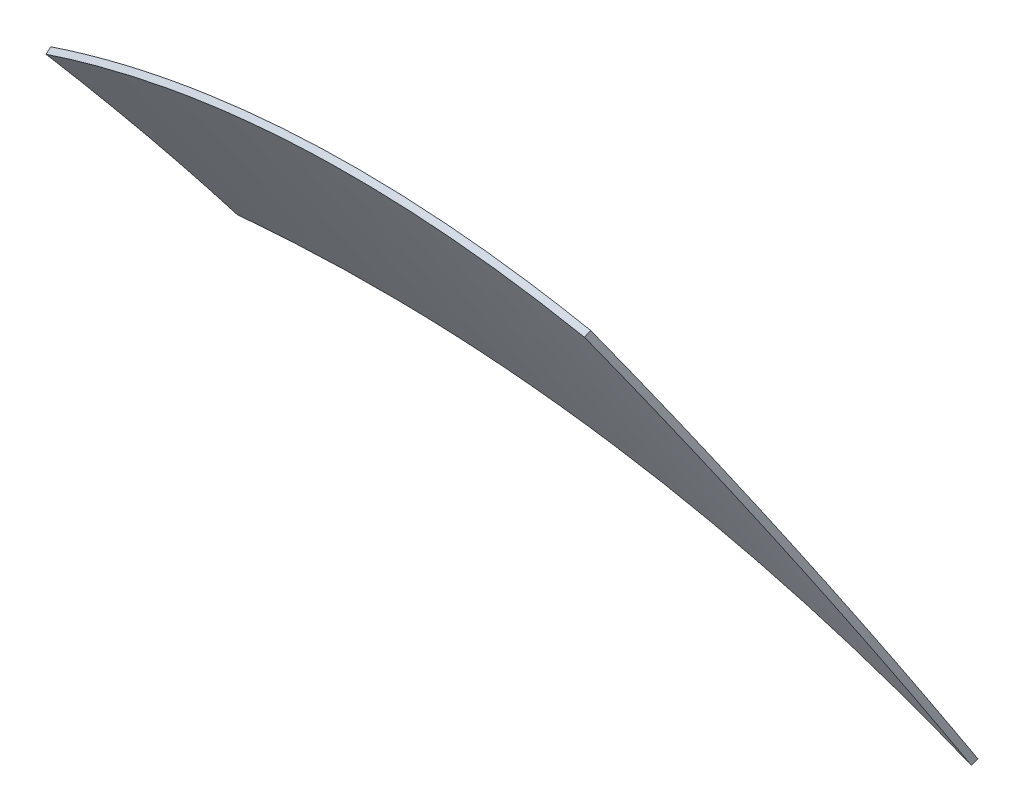
ISO-10303-21;
HEADER;
FILE_DESCRIPTION(('STEP AP214'),'2;1');
FILE_NAME('part.step','',(''),(''),'','','');
FILE_SCHEMA(('AUTOMOTIVE_DESIGN { 1 0 10303 214 1 1 1 1 }'));
ENDSEC;
DATA;
#1=APPLICATION_CONTEXT('core data for automotive mechanical design processes');
#2=APPLICATION_PROTOCOL_DEFINITION('international standard','automotive_design',2000,#1);
#3=PRODUCT_CONTEXT('',#1,'mechanical');
#4=PRODUCT('Part','Part','',(#3));
#5=PRODUCT_RELATED_PRODUCT_CATEGORY('part','',(#4));
#6=PRODUCT_DEFINITION_FORMATION('','',#4);
#7=PRODUCT_DEFINITION_CONTEXT('part definition',#1,'design');
#8=PRODUCT_DEFINITION('design','',#6,#7);
#9=PRODUCT_DEFINITION_SHAPE('','',#8);
#10=(LENGTH_UNIT() NAMED_UNIT(*) SI_UNIT(.MILLI.,.METRE.));
#11=(NAMED_UNIT(*) PLANE_ANGLE_UNIT() SI_UNIT($,.RADIAN.));
#12=(NAMED_UNIT(*) SI_UNIT($,.STERADIAN.) SOLID_ANGLE_UNIT());
#13=UNCERTAINTY_MEASURE_WITH_UNIT(LENGTH_MEASURE(1.E-05),#10,'distance_accuracy_value','');
#14=(GEOMETRIC_REPRESENTATION_CONTEXT(3) GLOBAL_UNCERTAINTY_ASSIGNED_CONTEXT((#13)) GLOBAL_UNIT_ASSIGNED_CONTEXT((#10,
#11,#12)) REPRESENTATION_CONTEXT('',''));
#15=CARTESIAN_POINT('',(0.,0.,0.));
#16=DIRECTION('',(0.,0.,1.));
#17=DIRECTION('',(1.,0.,0.));
#18=AXIS2_PLACEMENT_3D('',#15,#16,#17);
#19=CARTESIAN_POINT('',(143.886111195987,-179.002888895488,-2.70380006520971));
#20=DIRECTION('',(0.,0.,1.));
#21=DIRECTION('',(1.,0.,0.));
#22=AXIS2_PLACEMENT_3D('',#19,#20,#21);
#23=CONICAL_SURFACE('',#22,60.5897364806193,0.959931088596881);
#24=CARTESIAN_POINT('',(159.000603282272,-120.406885992308,-2.75685890943696));
#25=CARTESIAN_POINT('',(158.868996372965,-120.415108019953,-2.78545030843787));
#26=CARTESIAN_POINT('',(158.737427104817,-120.42380557177,-2.81408465073214));
#27=CARTESIAN_POINT('',(158.079736988366,-120.469669164971,-2.95747724797371));
#28=CARTESIAN_POINT('',(157.554232861495,-120.513953816298,-3.07286603493699));
#29=CARTESIAN_POINT('',(156.504984534706,-120.617575436179,-3.30487128910305));
#30=CARTESIAN_POINT('',(155.981240332852,-120.676912388172,-3.42148775495486));
#31=CARTESIAN_POINT('',(155.197293839859,-120.777122266393,-3.59725890114365));
#32=CARTESIAN_POINT('',(154.936266313888,-120.812391448551,-3.65598815937559));
#33=CARTESIAN_POINT('',(154.154016879108,-120.923795180198,-3.83260331287828));
#34=CARTESIAN_POINT('',(153.633666673088,-121.005521545311,-3.95090800184045));
#35=CARTESIAN_POINT('',(152.855288534,-121.139225228157,-4.12913834706854));
#36=CARTESIAN_POINT('',(152.596196517545,-121.185643564327,-4.18867514075154));
#37=CARTESIAN_POINT('',(151.819987968957,-121.330460371902,-4.36768401673878));
#38=CARTESIAN_POINT('',(151.303977427224,-121.434414597671,-4.48754584467776));
#39=CARTESIAN_POINT('',(150.532586401106,-121.601400992677,-4.66807100862768));
#40=CARTESIAN_POINT('',(150.275902940667,-121.65890330945,-4.72836589665372));
#41=CARTESIAN_POINT('',(149.507171471385,-121.836958599759,-4.90963885732585));
#42=CARTESIAN_POINT('',(148.996480970647,-121.963052141057,-5.03099626477721));
#43=CARTESIAN_POINT('',(147.97916095419,-122.229848783316,-5.27461689856439));
#44=CARTESIAN_POINT('',(147.472531433807,-122.37055186749,-5.39688012385928));
#45=CARTESIAN_POINT('',(146.463681735959,-122.666356472557,-5.64218370444104));
#46=CARTESIAN_POINT('',(145.961461553628,-122.821457977551,-5.76522405886974));
#47=CARTESIAN_POINT('',(144.96180367828,-123.145881553891,-6.01197671203673));
#48=CARTESIAN_POINT('',(144.464365981883,-123.315203615185,-6.13568901029999));
#49=CARTESIAN_POINT('',(143.474645062377,-123.66790318532,-6.38369270026669));
#50=CARTESIAN_POINT('',(142.9823618376,-123.851280689618,-6.50798409178284));
#51=CARTESIAN_POINT('',(142.003329601619,-124.231943844562,-6.75706926980549));
#52=CARTESIAN_POINT('',(141.516580590689,-124.4292294959,-6.88186305633694));
#53=CARTESIAN_POINT('',(140.549010723808,-124.837570668622,-7.1318871292262));
#54=CARTESIAN_POINT('',(140.06818987032,-125.048626195729,-7.2571174157654));
#55=CARTESIAN_POINT('',(138.811781328013,-125.621737577864,-7.58703760858172));
#56=CARTESIAN_POINT('',(138.041430416745,-125.99511797922,-7.79205746736365));
#57=CARTESIAN_POINT('',(137.280317100655,-126.38641701106,-7.99752302693644));
#58=B_SPLINE_CURVE_WITH_KNOTS('',3,(#24,#25,#26,#27,#28,#29,#30,#31,#32,#33,#34,#35,#36,#37,#38,
#39,#40,#41,#42,#43,#44,#45,#46,#47,#48,#49,#50,#51,#52,#53,#54,#55,#56,#57),.UNSPECIFIED.,.F.,
.F.,(4,2,2,2,2,2,2,2,2,2,2,2,2,2,2,2,4),(0.,0.404785696413259,2.02408023166759,3.64337298521062,
4.4529591876801,6.0722507887824,6.88183696519446,8.5011290756143,9.31071542367979,
10.9300092124914,12.5493011407591,14.1685912811835,15.78788027701,17.4071687491842,
19.0264573017742,20.6457465272929,23.2857191188557),.UNSPECIFIED.);
#59=CARTESIAN_POINT('',(159.000603282272,-120.406885992308,-2.75685890943713));
#60=VERTEX_POINT('',#59);
#61=CARTESIAN_POINT('',(137.280317100655,-126.38641701106,-7.99752302693646));
#62=VERTEX_POINT('',#61);
#63=EDGE_CURVE('E24',#60,#62,#58,.T.);
#64=ORIENTED_EDGE('',*,*,#63,.T.);
#65=CARTESIAN_POINT('',(137.280317100655,-126.38641701106,-7.99752302693634));
#66=CARTESIAN_POINT('',(137.346073829919,-126.480169329832,-8.06839270908214));
#67=CARTESIAN_POINT('',(137.410642669431,-126.57455949528,-8.13954595752961));
#68=CARTESIAN_POINT('',(137.727738792608,-127.049819377052,-8.49686090490361));
#69=CARTESIAN_POINT('',(137.962434095488,-127.439791521618,-8.78704423252073));
#70=CARTESIAN_POINT('',(138.304742334924,-128.070705816851,-9.25266430868433));
#71=CARTESIAN_POINT('',(138.424787649089,-128.306626052542,-9.42595602925372));
#72=CARTESIAN_POINT('',(138.586675772034,-128.646353030756,-9.67445744911099));
#73=CARTESIAN_POINT('',(138.633843112009,-128.748235736414,-9.74885104371466));
#74=CARTESIAN_POINT('',(138.838328436284,-129.203056882448,-10.0804026850149));
#75=CARTESIAN_POINT('',(138.982865127089,-129.560498316779,-10.3394946224086));
#76=CARTESIAN_POINT('',(139.151020482897,-130.026623607484,-10.6757424971131));
#77=CARTESIAN_POINT('',(139.187645436249,-130.131786496136,-10.7514987942403));
#78=CARTESIAN_POINT('',(139.342671087473,-130.593388170934,-11.0835807574485));
#79=CARTESIAN_POINT('',(139.448569740083,-130.953067853541,-11.3411894895931));
#80=CARTESIAN_POINT('',(139.540526599407,-131.315833036907,-11.5999996128498));
#81=B_SPLINE_CURVE_WITH_KNOTS('',3,(#65,#66,#67,#68,#69,#70,#71,#72,#73,#74,#75,#76,#77,#78,#79,
#80),.UNSPECIFIED.,.F.,.F.,(4,2,2,2,2,2,2,4),(0.,0.404039967200036,2.02138933712667,
2.97026784667486,3.37430460638291,4.76665393129998,5.17069019074428,6.53488990231758),.UNSPECIFIED.);
#82=CARTESIAN_POINT('',(139.540526599974,-131.315833039146,-11.5999996144473));
#83=VERTEX_POINT('',#82);
#84=EDGE_CURVE('E119',#62,#83,#81,.T.);
#85=ORIENTED_EDGE('',*,*,#84,.T.);
#86=CARTESIAN_POINT('',(139.540526599837,-131.31583304145,-11.5999996160448));
#87=CARTESIAN_POINT('',(139.676253094714,-131.303464573611,-11.5999996494659));
#88=CARTESIAN_POINT('',(139.81203545121,-131.291682740631,-11.6000047399861));
#89=CARTESIAN_POINT('',(140.491273851522,-131.235699033783,-11.6000530761266));
#90=CARTESIAN_POINT('',(141.035482772042,-131.200294875741,-11.600164976607));
#91=CARTESIAN_POINT('',(142.124778048438,-131.148216950844,-11.6004735845127));
#92=CARTESIAN_POINT('',(142.669864403156,-131.131543159291,-11.6006702918262));
#93=CARTESIAN_POINT('',(143.760292319413,-131.116868704735,-11.6010958966137));
#94=CARTESIAN_POINT('',(144.305633880668,-131.118868020988,-11.6013247940521));
#95=CARTESIAN_POINT('',(145.395925079836,-131.141475656189,-11.6017712994732));
#96=CARTESIAN_POINT('',(145.9408747181,-131.162083958492,-11.6019889074661));
#97=CARTESIAN_POINT('',(147.029770357153,-131.221839551364,-11.6023789968106));
#98=CARTESIAN_POINT('',(147.573716358617,-131.260986829483,-11.6025514781926));
#99=CARTESIAN_POINT('',(148.388332883955,-131.333544991111,-11.6027589088266));
#100=CARTESIAN_POINT('',(148.659639941453,-131.360035437354,-11.6028195018991));
#101=CARTESIAN_POINT('',(149.472906483721,-131.446419760102,-11.6029726866673));
#102=CARTESIAN_POINT('',(150.01415254132,-131.513222387737,-11.6030366646331));
#103=CARTESIAN_POINT('',(151.094047865325,-131.66515436737,-11.603079962301));
#104=CARTESIAN_POINT('',(151.632697131986,-131.750283717566,-11.6030592820114));
#105=CARTESIAN_POINT('',(152.706813723352,-131.938780346686,-11.6029358242978));
#106=CARTESIAN_POINT('',(153.242281047633,-132.042147628043,-11.6028330468628));
#107=CARTESIAN_POINT('',(154.042547615953,-132.210783436978,-11.6026274061385));
#108=CARTESIAN_POINT('',(154.308799759609,-132.269255994156,-11.6025502856933));
#109=CARTESIAN_POINT('',(155.106084813268,-132.451469721315,-11.6022970818051));
#110=CARTESIAN_POINT('',(155.635588125078,-132.581995708677,-11.6020991678315));
#111=CARTESIAN_POINT('',(156.689822971056,-132.861012042431,-11.6016733387581));
#112=CARTESIAN_POINT('',(157.214554501858,-133.009502401499,-11.6014454236373));
#113=CARTESIAN_POINT('',(158.258652445428,-133.324336269461,-11.6009981951487));
#114=CARTESIAN_POINT('',(158.778018853219,-133.490679794916,-11.6007788817889));
#115=CARTESIAN_POINT('',(159.552498468685,-133.753462025631,-11.6004924206137));
#116=CARTESIAN_POINT('',(159.809882692383,-133.843261974162,-11.6004040220465));
#117=CARTESIAN_POINT('',(160.715743657025,-134.168071869904,-11.6001296377149));
#118=CARTESIAN_POINT('',(161.35995496861,-134.414999155828,-11.6000013308));
#119=CARTESIAN_POINT('',(161.998580872811,-134.675946256563,-11.599999616045));
#120=B_SPLINE_CURVE_WITH_KNOTS('',3,(#86,#87,#88,#89,#90,#91,#92,#93,#94,#95,#96,#97,#98,#99,
#100,#101,#102,#103,#104,#105,#106,#107,#108,#109,#110,#111,#112,#113,#114,#115,#116,#117,#118,
#119),.UNSPECIFIED.,.F.,.F.,(4,2,2,2,2,2,2,2,2,2,2,2,2,2,2,2,4),(0.,0.408872020403955,
2.04458806893953,3.68030196076419,5.31601403561012,6.95172464748583,8.58743416094518,
9.40520006365924,11.0409086284243,12.6766170324512,14.3123256546456,15.1300915836599,
16.7658012399093,18.4015120504021,20.0372243783083,20.8549909031556,22.9242005441175),.UNSPECIFIED.);
#121=CARTESIAN_POINT('',(161.998580890134,-134.675946252142,-11.5999996085915));
#122=VERTEX_POINT('',#121);
#123=EDGE_CURVE('E69',#83,#122,#120,.T.);
#124=ORIENTED_EDGE('',*,*,#123,.T.);
#125=CARTESIAN_POINT('',(161.998580907457,-134.675946247722,-11.5999996011381));
#126=CARTESIAN_POINT('',(161.997590271595,-134.562808413429,-11.5269277902546));
#127=CARTESIAN_POINT('',(161.996096560274,-134.449630820928,-11.4539216347736));
#128=CARTESIAN_POINT('',(161.990078849087,-134.109973028291,-11.2350974389005));
#129=CARTESIAN_POINT('',(161.984018265331,-133.883385495463,-11.0894851182758));
#130=CARTESIAN_POINT('',(161.971745640513,-133.543321684487,-10.8715028258498));
#131=CARTESIAN_POINT('',(161.967124043145,-133.429928791483,-10.7989097402121));
#132=CARTESIAN_POINT('',(161.956808762897,-133.203092349561,-10.6538742391049));
#133=CARTESIAN_POINT('',(161.951115060103,-133.089648799742,-10.5814318264595));
#134=CARTESIAN_POINT('',(161.932349125899,-132.748701818731,-10.3639914226964));
#135=CARTESIAN_POINT('',(161.917611726687,-132.521134208185,-10.2192342228794));
#136=CARTESIAN_POINT('',(161.88385247948,-132.065914937352,-9.93034382979057));
#137=CARTESIAN_POINT('',(161.864830500268,-131.838263274704,-9.78621065576741));
#138=CARTESIAN_POINT('',(161.822876580502,-131.38294812841,-9.49848978398958));
#139=CARTESIAN_POINT('',(161.799944307828,-131.155284645405,-9.35490213362851));
#140=CARTESIAN_POINT('',(161.749886674746,-130.700020846647,-9.06835953351966));
#141=CARTESIAN_POINT('',(161.722761341065,-130.472420530501,-8.92540457974492));
#142=CARTESIAN_POINT('',(161.664128332999,-130.017355672167,-8.64018557339049));
#143=CARTESIAN_POINT('',(161.632620744078,-129.789891127418,-8.49792150739291));
#144=CARTESIAN_POINT('',(161.565125854969,-129.335174427365,-8.21412098343501));
#145=CARTESIAN_POINT('',(161.529138517905,-129.107922273824,-8.07258453147436));
#146=CARTESIAN_POINT('',(161.414507140135,-128.426653033405,-7.64910918929064));
#147=CARTESIAN_POINT('',(161.329185107145,-127.973056158462,-7.36826233444211));
#148=CARTESIAN_POINT('',(161.188346340189,-127.294576190179,-6.94955412942503));
#149=CARTESIAN_POINT('',(161.139324221688,-127.069005993567,-6.81057761293945));
#150=CARTESIAN_POINT('',(161.037007640919,-126.618406863882,-6.5333784816293));
#151=CARTESIAN_POINT('',(160.983713667505,-126.393377871904,-6.39515578246889));
#152=CARTESIAN_POINT('',(160.817448107943,-125.719155903876,-5.98159507149227));
#153=CARTESIAN_POINT('',(160.698095071437,-125.270838476496,-5.70737094765872));
#154=CARTESIAN_POINT('',(160.442407511498,-124.37716461964,-5.16201914061118));
#155=CARTESIAN_POINT('',(160.306072948893,-123.931808196996,-4.8908914645413));
#156=CARTESIAN_POINT('',(160.088742379047,-123.266527374478,-4.48668215331442));
#157=CARTESIAN_POINT('',(160.014164747766,-123.045236965336,-4.35236601043497));
#158=CARTESIAN_POINT('',(159.796180935591,-122.417992340212,-3.97199681027928));
#159=CARTESIAN_POINT('',(159.647623507807,-122.013204716899,-3.72694447245969));
#160=CARTESIAN_POINT('',(159.335456432489,-121.207147805247,-3.23966271820476));
#161=CARTESIAN_POINT('',(159.171831953752,-120.805882418788,-2.99743635348038));
#162=CARTESIAN_POINT('',(159.000603282273,-120.406885992309,-2.75685890943728));
#163=B_SPLINE_CURVE_WITH_KNOTS('',3,(#125,#126,#127,#128,#129,#130,#131,#132,#133,#134,#135,
#136,#137,#138,#139,#140,#141,#142,#143,#144,#145,#146,#147,#148,#149,#150,#151,#152,#153,#154,
#155,#156,#157,#158,#159,#160,#161,#162),.UNSPECIFIED.,.F.,.F.,(4,2,2,2,2,2,2,2,2,2,2,2,2,2,2,2,
2,2,4),(0.,0.404064075405057,1.21225541557342,1.61640714962979,2.02056639180692,2.8308531072461,
3.64116464107547,4.45154503256035,5.26192025873226,6.07227968296461,6.88264577848423,
8.50313946363864,9.31144131291305,10.1196507950632,11.7361074706229,13.3525678749169,
14.1607179953456,15.6483256120284,17.1374135314015),.UNSPECIFIED.);
#164=EDGE_CURVE('E66',#122,#60,#163,.T.);
#165=ORIENTED_EDGE('',*,*,#164,.T.);
#166=EDGE_LOOP('',(#64,#85,#124,#165));
#167=FACE_BOUND('',#166,.T.);
#168=ADVANCED_FACE('F17',(#167),#23,.F.);
#169=CARTESIAN_POINT('',(137.26588431921,-126.271457018646,-8.16299173988275));
#170=CARTESIAN_POINT('',(137.265931952152,-126.271836424562,-8.16244563851989));
#171=CARTESIAN_POINT('',(137.265979585094,-126.272215830477,-8.16189953715703));
#172=CARTESIAN_POINT('',(137.266027218036,-126.272595236393,-8.16135343579417));
#173=CARTESIAN_POINT('',(137.270790512242,-126.310535827949,-8.10674329950824));
#174=CARTESIAN_POINT('',(137.275553806449,-126.348476419504,-8.05213316322231));
#175=CARTESIAN_POINT('',(137.280317100655,-126.38641701106,-7.99752302693638));
#176=CARTESIAN_POINT('',(141.108711105439,-124.299132489044,-7.1278973751028));
#177=CARTESIAN_POINT('',(141.108729746323,-124.29951553917,-7.12735127373994));
#178=CARTESIAN_POINT('',(141.108748387207,-124.299898589296,-7.12680517237708));
#179=CARTESIAN_POINT('',(141.108767028091,-124.300281639422,-7.12625907101422));
#180=CARTESIAN_POINT('',(141.110631116481,-124.33858665203,-7.07164893472829));
#181=CARTESIAN_POINT('',(141.112500528528,-124.376889685273,-7.01703879844236));
#182=CARTESIAN_POINT('',(141.114364616918,-124.415194697881,-6.96242866215643));
#183=CARTESIAN_POINT('',(148.307201807915,-121.61778876772,-5.31572065577417));
#184=CARTESIAN_POINT('',(148.307170687512,-121.618172132201,-5.31517455441131));
#185=CARTESIAN_POINT('',(148.307139567109,-121.618555496682,-5.31462845304845));
#186=CARTESIAN_POINT('',(148.307108446706,-121.618938861163,-5.31408235168559));
#187=CARTESIAN_POINT('',(148.303996406401,-121.657275309275,-5.25947221539965));
#188=CARTESIAN_POINT('',(148.300882149644,-121.695612322051,-5.20486207911372));
#189=CARTESIAN_POINT('',(148.297770109339,-121.733948770163,-5.15025194282779));
#190=CARTESIAN_POINT('',(155.82976669929,-120.492788829683,-3.61624611019746));
#191=CARTESIAN_POINT('',(155.829689808423,-120.493163897655,-3.6157000088346));
#192=CARTESIAN_POINT('',(155.829612917557,-120.493538965627,-3.61515390747174));
#193=CARTESIAN_POINT('',(155.82953602669,-120.493914033599,-3.61460780610888));
#194=CARTESIAN_POINT('',(155.821846940025,-120.531420830805,-3.55999766982295));
#195=CARTESIAN_POINT('',(155.81415866287,-120.568927517024,-3.50538753353702));
#196=CARTESIAN_POINT('',(155.806469576205,-120.60643431423,-3.45077739725108));
#197=CARTESIAN_POINT('',(159.029542091058,-120.294695750389,-2.92232762238331));
#198=CARTESIAN_POINT('',(159.029446583438,-120.295066015213,-2.92178152102045));
#199=CARTESIAN_POINT('',(159.029351075819,-120.295436280038,-2.92123541965759));
#200=CARTESIAN_POINT('',(159.029255568199,-120.295806544863,-2.92068931829473));
#201=CARTESIAN_POINT('',(159.019704806224,-120.332833027345,-2.8660791820088));
#202=CARTESIAN_POINT('',(159.010154044248,-120.369859509826,-2.81146904572286));
#203=CARTESIAN_POINT('',(159.000603282272,-120.406885992308,-2.75685890943693));
#204=B_SPLINE_SURFACE_WITH_KNOTS('',3,3,((#169,#170,#171,#172,#173,#174,#175),(#176,#177,#178,
#179,#180,#181,#182),(#183,#184,#185,#186,#187,#188,#189),(#190,#191,#192,#193,#194,#195,#196),
(#197,#198,#199,#200,#201,#202,#203)),.UNSPECIFIED.,.F.,.F.,.F.,(4,1,4),(4,3,4),(0.,
0.571428571428571,1.),(-0.01,0.,1.),.UNSPECIFIED.);
#205=DIRECTION('',(0.0714494130898966,-0.569108873337561,0.819152044285773));
#206=VECTOR('',#205,1.);
#207=CARTESIAN_POINT('',(137.273243608759,-126.3300752326,-8.07861907932102));
#208=LINE('',#207,#206);
#209=CARTESIAN_POINT('',(137.266359203589,-126.275234778063,-8.15755361789289));
#210=VERTEX_POINT('',#209);
#211=EDGE_CURVE('E78',#210,#62,#208,.T.);
#212=DIRECTION('',(0.143261429625733,0.555397237218921,-0.819152044294087));
#213=VECTOR('',#212,1.);
#214=CARTESIAN_POINT('',(159.014929425236,-120.351346268586,-2.83877411386612));
#215=LINE('',#214,#213);
#216=CARTESIAN_POINT('',(159.029255564672,-120.295806536668,-2.9206893133552));
#217=VERTEX_POINT('',#216);
#218=EDGE_CURVE('E73',#60,#217,#215,.T.);
#219=CARTESIAN_POINT('',(137.266359768493,-126.275234487946,-8.15755346593855));
#220=CARTESIAN_POINT('',(137.381933088134,-126.215879534922,-8.12646529592531));
#221=CARTESIAN_POINT('',(137.497722102638,-126.156936136721,-8.09538663018119));
#222=CARTESIAN_POINT('',(138.07776970358,-125.864260778798,-7.94003115851836));
#223=CARTESIAN_POINT('',(138.545211084075,-125.636718182318,-7.8159015389788));
#224=CARTESIAN_POINT('',(139.486428808318,-125.194963795953,-7.56799563190177));
#225=CARTESIAN_POINT('',(139.960205145681,-124.980751992632,-7.44421934400832));
#226=CARTESIAN_POINT('',(140.913715679228,-124.565764920714,-7.19705711530892));
#227=CARTESIAN_POINT('',(141.393449871456,-124.364989643198,-7.07367117424389));
#228=CARTESIAN_POINT('',(142.358465018234,-123.977011185478,-6.8273531765557));
#229=CARTESIAN_POINT('',(142.843745971019,-123.789808000956,-6.70442111978811));
#230=CARTESIAN_POINT('',(144.307770470838,-123.248607259321,-6.33629907344243));
#231=CARTESIAN_POINT('',(145.294425098614,-122.915136242204,-6.09185330339367));
#232=CARTESIAN_POINT('',(146.78745729217,-122.457129478066,-5.72736298164739));
#233=CARTESIAN_POINT('',(147.287238281659,-122.311511424192,-5.606246201894));
#234=CARTESIAN_POINT('',(148.290946902241,-122.03446959273,-5.36481434530529));
#235=CARTESIAN_POINT('',(148.79487453806,-121.903045831322,-5.24449926938402));
#236=CARTESIAN_POINT('',(149.553537006694,-121.716731142714,-5.06474264131422));
#237=CARTESIAN_POINT('',(149.806877148484,-121.656431717692,-5.00494523922027));
#238=CARTESIAN_POINT('',(150.568285579898,-121.480934602687,-4.8258973870083));
#239=CARTESIAN_POINT('',(151.077705334762,-121.371147601247,-4.70700001334888));
#240=CARTESIAN_POINT('',(151.844118169689,-121.21733311068,-4.52939912991767));
#241=CARTESIAN_POINT('',(152.099960294325,-121.167874218312,-4.47032516832845));
#242=CARTESIAN_POINT('',(153.381435687157,-120.929555606238,-4.17547118423603));
#243=CARTESIAN_POINT('',(154.412759517213,-120.767850380949,-3.94149498606093));
#244=CARTESIAN_POINT('',(156.042665509963,-120.559418695866,-3.57668808432938));
#245=CARTESIAN_POINT('',(156.638511913735,-120.493052976394,-3.44436189412908));
#246=CARTESIAN_POINT('',(157.832373923222,-120.379791650717,-3.18130297558091));
#247=CARTESIAN_POINT('',(158.430389429914,-120.332895166726,-3.05057017565188));
#248=CARTESIAN_POINT('',(159.029255512945,-120.295806548284,-2.92068933027759));
#249=B_SPLINE_CURVE_WITH_KNOTS('',3,(#219,#220,#221,#222,#223,#224,#225,#226,#227,#228,#229,
#230,#231,#232,#233,#234,#235,#236,#237,#238,#239,#240,#241,#242,#243,#244,#245,#246,#247,#248),
.UNSPECIFIED.,.F.,.F.,(4,2,2,2,2,2,2,2,2,2,2,2,2,2,4),(0.,0.400777817122861,2.00403350562889,
3.60728757826702,5.21054058658878,6.81379308474326,10.0212067539823,11.62446114391,
13.2277173614392,14.0292876745347,15.6325445361068,16.4341146152725,19.6415504903119,
21.4831713831441,23.3247092361376),.UNSPECIFIED.);
#250=EDGE_CURVE('E113',#210,#217,#249,.T.);
#251=ORIENTED_EDGE('',*,*,#211,.T.);
#252=ORIENTED_EDGE('',*,*,#63,.F.);
#253=ORIENTED_EDGE('',*,*,#218,.T.);
#254=ORIENTED_EDGE('',*,*,#250,.F.);
#255=EDGE_LOOP('',(#251,#252,#253,#254));
#256=FACE_BOUND('',#255,.T.);
#257=ADVANCED_FACE('F75',(#256),#204,.F.);
#258=CARTESIAN_POINT('',(159.029542091058,-120.29469575039,-2.92232762238351));
#259=CARTESIAN_POINT('',(159.029446583438,-120.295066015214,-2.92178152102065));
#260=CARTESIAN_POINT('',(159.029351075819,-120.295436280039,-2.92123541965779));
#261=CARTESIAN_POINT('',(159.029255568199,-120.295806544864,-2.92068931829493));
#262=CARTESIAN_POINT('',(159.019704806224,-120.332833027345,-2.86607918200905));
#263=CARTESIAN_POINT('',(159.010154044248,-120.369859509827,-2.81146904572318));
#264=CARTESIAN_POINT('',(159.000603282273,-120.406885992309,-2.7568589094373));
#265=CARTESIAN_POINT('',(159.000506819577,-120.407259959782,-2.75630734706081));
#266=CARTESIAN_POINT('',(159.000410356881,-120.407633927255,-2.75575578468432));
#267=CARTESIAN_POINT('',(159.000313894185,-120.408007894728,-2.75520422230784));
#268=CARTESIAN_POINT('',(160.197955565732,-123.010052846465,-4.55903629348517));
#269=CARTESIAN_POINT('',(160.197848999184,-123.010420264338,-4.55849019212231));
#270=CARTESIAN_POINT('',(160.197742432636,-123.010787682212,-4.55794409075945));
#271=CARTESIAN_POINT('',(160.197635866088,-123.011155100085,-4.55739798939659));
#272=CARTESIAN_POINT('',(160.186979211278,-123.047896887433,-4.5027878531107));
#273=CARTESIAN_POINT('',(160.176324894259,-123.08463758767,-4.44817771682481));
#274=CARTESIAN_POINT('',(160.165668239448,-123.121379375018,-4.39356758053893));
#275=CARTESIAN_POINT('',(160.165560607234,-123.12175046707,-4.39301601816244));
#276=CARTESIAN_POINT('',(160.165452975021,-123.122121559122,-4.39246445578596));
#277=CARTESIAN_POINT('',(160.165345342807,-123.122492651175,-4.39191289340947));
#278=CARTESIAN_POINT('',(161.307821720107,-126.86585198087,-6.90069532388278));
#279=CARTESIAN_POINT('',(161.307701052511,-126.866215007717,-6.90014922251992));
#280=CARTESIAN_POINT('',(161.307580384914,-126.866578034563,-6.89960312115706));
#281=CARTESIAN_POINT('',(161.307459717317,-126.86694106141,-6.8990570197942));
#282=CARTESIAN_POINT('',(161.295392957634,-126.903243746073,-6.8444468835083));
#283=CARTESIAN_POINT('',(161.283327631622,-126.939546886087,-6.7898367472224));
#284=CARTESIAN_POINT('',(161.271260871939,-126.97584957075,-6.7352266109365));
#285=CARTESIAN_POINT('',(161.271138997666,-126.976216227865,-6.73467504856001));
#286=CARTESIAN_POINT('',(161.271017123393,-126.97658288498,-6.73412348618352));
#287=CARTESIAN_POINT('',(161.270895249121,-126.976949542095,-6.73357192380704));
#288=CARTESIAN_POINT('',(161.831047765252,-130.788838281944,-9.35522559756797));
#289=CARTESIAN_POINT('',(161.830914459895,-130.789196697743,-9.35467949620511));
#290=CARTESIAN_POINT('',(161.830781154537,-130.789555113541,-9.35413339484225));
#291=CARTESIAN_POINT('',(161.83064784918,-130.789913529339,-9.35358729347939));
#292=CARTESIAN_POINT('',(161.817317313436,-130.825755109159,-9.29897715719347));
#293=CARTESIAN_POINT('',(161.803983993332,-130.861595846348,-9.24436702090756));
#294=CARTESIAN_POINT('',(161.790653457588,-130.897437426168,-9.18975688462165));
#295=CARTESIAN_POINT('',(161.790518819177,-130.897799426124,-9.18920532224516));
#296=CARTESIAN_POINT('',(161.790384180766,-130.89816142608,-9.18865375986868));
#297=CARTESIAN_POINT('',(161.790249542355,-130.898523426037,-9.18810219749219));
#298=CARTESIAN_POINT('',(161.997423132375,-132.841866517554,-10.655808054195));
#299=CARTESIAN_POINT('',(161.997283503026,-132.842222511742,-10.6552619528321));
#300=CARTESIAN_POINT('',(161.997143873678,-132.842578505931,-10.6547158514693));
#301=CARTESIAN_POINT('',(161.99700424433,-132.842934500119,-10.6541697501064));
#302=CARTESIAN_POINT('',(161.983041309508,-132.878533918963,-10.5995596138204));
#303=CARTESIAN_POINT('',(161.969081491953,-132.914134109023,-10.5449494775345));
#304=CARTESIAN_POINT('',(161.955118557132,-132.949733527867,-10.4903393412486));
#305=CARTESIAN_POINT('',(161.95497753149,-132.950093081997,-10.4897877788721));
#306=CARTESIAN_POINT('',(161.954836505849,-132.950452636128,-10.4892362164956));
#307=CARTESIAN_POINT('',(161.954695480207,-132.950812190258,-10.4886846541191));
#308=CARTESIAN_POINT('',(162.035725189123,-133.874251659509,-11.3171126533402));
#309=CARTESIAN_POINT('',(162.035582550259,-133.8746064484,-11.3165665519773));
#310=CARTESIAN_POINT('',(162.035439911395,-133.87496123729,-11.3160204506145));
#311=CARTESIAN_POINT('',(162.035297272531,-133.87531602618,-11.3154743492516));
#312=CARTESIAN_POINT('',(162.021033386143,-133.910794915202,-11.2608642129657));
#313=CARTESIAN_POINT('',(162.006764655779,-133.946272419403,-11.2062540766797));
#314=CARTESIAN_POINT('',(161.99250076939,-133.981751308426,-11.1516439403938));
#315=CARTESIAN_POINT('',(161.992356704137,-133.982109645205,-11.1510923780173));
#316=CARTESIAN_POINT('',(161.992212638885,-133.982467981984,-11.1505408156408));
#317=CARTESIAN_POINT('',(161.992068573632,-133.982826318763,-11.1499892532643));
#318=CARTESIAN_POINT('',(162.04240612227,-134.568692076656,-11.7654683091632));
#319=CARTESIAN_POINT('',(162.042261484597,-134.569046050792,-11.7649222078003));
#320=CARTESIAN_POINT('',(162.042116846924,-134.569400024929,-11.7643761064375));
#321=CARTESIAN_POINT('',(162.041972209251,-134.569753999066,-11.7638300050746));
#322=CARTESIAN_POINT('',(162.027508441964,-134.605151412744,-11.7092198687886));
#323=CARTESIAN_POINT('',(162.013044674677,-134.640548826423,-11.6546097325027));
#324=CARTESIAN_POINT('',(161.99858090739,-134.675946240102,-11.5999995962168));
#325=CARTESIAN_POINT('',(161.99843482334,-134.67630375398,-11.5994480338403));
#326=CARTESIAN_POINT('',(161.998288739291,-134.676661267858,-11.5988964714638));
#327=CARTESIAN_POINT('',(161.998142655241,-134.677018781737,-11.5983449090873));
#328=B_SPLINE_SURFACE_WITH_KNOTS('',3,3,((#258,#259,#260,#261,#262,#263,#264,#265,#266,#267),
(#268,#269,#270,#271,#272,#273,#274,#275,#276,#277),(#278,#279,#280,#281,#282,#283,#284,#285,
#286,#287),(#288,#289,#290,#291,#292,#293,#294,#295,#296,#297),(#298,#299,#300,#301,#302,#303,
#304,#305,#306,#307),(#308,#309,#310,#311,#312,#313,#314,#315,#316,#317),(#318,#319,#320,#321,
#322,#323,#324,#325,#326,#327)),.UNSPECIFIED.,.F.,.F.,.F.,(4,1,1,1,4),(4,3,3,4),(0.,
0.571428571428571,0.785714285714286,0.857142857142857,1.),(-0.01,0.,1.,1.0101),.UNSPECIFIED.);
#329=DIRECTION('',(0.216956509044363,0.530961205295563,-0.819152044283823));
#330=VECTOR('',#329,1.);
#331=CARTESIAN_POINT('',(162.020664119772,-134.621901500679,-11.6833783340814));
#332=LINE('',#331,#330);
#333=CARTESIAN_POINT('',(162.041841000538,-134.570074814362,-11.7633350556306));
#334=VERTEX_POINT('',#333);
#335=EDGE_CURVE('E84',#122,#334,#332,.T.);
#336=CARTESIAN_POINT('',(159.029255561146,-120.295806528472,-2.92068930841486));
#337=CARTESIAN_POINT('',(159.075366722003,-120.402971586419,-2.98528436388494));
#338=CARTESIAN_POINT('',(159.120928240346,-120.510302990929,-3.0499999015797));
#339=CARTESIAN_POINT('',(159.34602810086,-121.047819169276,-3.37420315951357));
#340=CARTESIAN_POINT('',(159.517365780141,-121.480402934272,-3.63546003554373));
#341=CARTESIAN_POINT('',(159.843373966155,-122.351012097047,-4.16211480505085));
#342=CARTESIAN_POINT('',(159.997999132907,-122.789048871733,-4.42752183264644));
#343=CARTESIAN_POINT('',(160.290371249997,-123.668801454727,-4.96160304024383));
#344=CARTESIAN_POINT('',(160.428116851372,-124.110517554067,-5.23027747948374));
#345=CARTESIAN_POINT('',(160.686861993,-124.99694455598,-5.77069026533099));
#346=CARTESIAN_POINT('',(160.807861990788,-125.441655376381,-6.04242852800701));
#347=CARTESIAN_POINT('',(161.033108982606,-126.333460130504,-6.58884027889458));
#348=CARTESIAN_POINT('',(161.137357632623,-126.780553824142,-6.86351347410071));
#349=CARTESIAN_POINT('',(161.280893438291,-127.451941201545,-7.27730321787134));
#350=CARTESIAN_POINT('',(161.326545741928,-127.67555666423,-7.41534074416131));
#351=CARTESIAN_POINT('',(161.413601363982,-128.123200800743,-7.69214951838286));
#352=CARTESIAN_POINT('',(161.455004185226,-128.347229519806,-7.83092085017397));
#353=CARTESIAN_POINT('',(161.533489129044,-128.795605931276,-8.1091866255312));
#354=CARTESIAN_POINT('',(161.570571090822,-129.019953635239,-8.24868109580641));
#355=CARTESIAN_POINT('',(161.640358959105,-129.468879775191,-8.52838402303622));
#356=CARTESIAN_POINT('',(161.67306493234,-129.693458207608,-8.66859246906957));
#357=CARTESIAN_POINT('',(161.734165200283,-130.142770326724,-8.94969439169056));
#358=CARTESIAN_POINT('',(161.762559520324,-130.367504012501,-9.09058786424854));
#359=CARTESIAN_POINT('',(161.815173006797,-130.817050736292,-9.37301184925445));
#360=CARTESIAN_POINT('',(161.839392270057,-131.041863772344,-9.51454234685033));
#361=CARTESIAN_POINT('',(161.883963141527,-131.491519309728,-9.79816397710461));
#362=CARTESIAN_POINT('',(161.904314742006,-131.716361811118,-9.940255110883));
#363=CARTESIAN_POINT('',(161.940567766119,-132.160427430951,-10.2214807069553));
#364=CARTESIAN_POINT('',(161.956567125662,-132.379651480361,-10.3606009975476));
#365=CARTESIAN_POINT('',(161.984431822777,-132.817974743578,-10.6394491998421));
#366=CARTESIAN_POINT('',(161.996297185892,-133.037073958148,-10.7791771077845));
#367=CARTESIAN_POINT('',(162.016039131634,-133.47529789014,-11.0593334333765));
#368=CARTESIAN_POINT('',(162.023911893657,-133.694422432045,-11.1997623926314));
#369=CARTESIAN_POINT('',(162.035766298747,-134.132437906291,-11.4811560247494));
#370=CARTESIAN_POINT('',(162.039747880279,-134.351328834883,-11.6221207060494));
#371=CARTESIAN_POINT('',(162.041841112907,-134.570074699214,-11.763334951219));
#372=B_SPLINE_CURVE_WITH_KNOTS('',3,(#336,#337,#338,#339,#340,#341,#342,#343,#344,#345,#346,
#347,#348,#349,#350,#351,#352,#353,#354,#355,#356,#357,#358,#359,#360,#361,#362,#363,#364,#365,
#366,#367,#368,#369,#370,#371),.UNSPECIFIED.,.F.,.F.,(4,2,2,2,2,2,2,2,2,2,2,2,2,2,2,2,2,4),(0.,
0.400064412403109,2.00054436326323,3.60526274059047,5.21010927867827,6.81491195941061,
8.41955589633506,9.21970311834363,10.0199438477154,10.8202143475786,11.6204726427579,
12.4207262361049,13.220961267448,14.0211978982469,14.8015680574717,15.5819333947729,
16.3630440779436,17.1441671137845),.UNSPECIFIED.);
#373=EDGE_CURVE('E81',#217,#334,#372,.T.);
#374=ORIENTED_EDGE('',*,*,#218,.F.);
#375=ORIENTED_EDGE('',*,*,#164,.F.);
#376=ORIENTED_EDGE('',*,*,#335,.T.);
#377=ORIENTED_EDGE('',*,*,#373,.F.);
#378=EDGE_LOOP('',(#374,#375,#376,#377));
#379=FACE_BOUND('',#378,.T.);
#380=ADVANCED_FACE('F79',(#379),#328,.F.);
#381=CARTESIAN_POINT('',(162.042747287869,-134.567857002997,-11.7667566681629));
#382=CARTESIAN_POINT('',(162.042488943073,-134.568489254432,-11.7657812483945));
#383=CARTESIAN_POINT('',(162.042230598277,-134.569121505868,-11.7648058286262));
#384=CARTESIAN_POINT('',(162.041972253481,-134.569753757303,-11.7638304088578));
#385=CARTESIAN_POINT('',(162.027508486212,-134.605151170989,-11.7092202725719));
#386=CARTESIAN_POINT('',(162.013044718943,-134.640548584675,-11.6546101362859));
#387=CARTESIAN_POINT('',(161.998580951674,-134.675945998361,-11.6));
#388=CARTESIAN_POINT('',(161.998433730553,-134.676306295012,-11.5994441444395));
#389=CARTESIAN_POINT('',(161.998286509433,-134.676666591663,-11.5988882888789));
#390=CARTESIAN_POINT('',(161.998139288312,-134.677026888315,-11.5983324333184));
#391=CARTESIAN_POINT('',(154.951159948365,-131.670157139181,-11.7667566681629));
#392=CARTESIAN_POINT('',(154.951002487298,-131.670830727024,-11.7657812483945));
#393=CARTESIAN_POINT('',(154.950845026232,-131.671504314868,-11.7648058286262));
#394=CARTESIAN_POINT('',(154.950687565165,-131.672177902711,-11.7638304088578));
#395=CARTESIAN_POINT('',(154.941871903861,-131.70988958862,-11.7092202725719));
#396=CARTESIAN_POINT('',(154.933059623976,-131.747583471672,-11.6546101362859));
#397=CARTESIAN_POINT('',(154.924243962672,-131.78529515758,-11.6));
#398=CARTESIAN_POINT('',(154.924154231448,-131.785679010318,-11.5994441444395));
#399=CARTESIAN_POINT('',(154.924064500225,-131.786062863055,-11.5988882888789));
#400=CARTESIAN_POINT('',(154.923974769001,-131.786446715793,-11.5983324333184));
#401=CARTESIAN_POINT('',(147.15908079888,-130.504327376763,-11.7667566681629));
#402=CARTESIAN_POINT('',(147.159034217102,-130.505017554065,-11.7657812483945));
#403=CARTESIAN_POINT('',(147.158987635323,-130.505707731367,-11.7648058286262));
#404=CARTESIAN_POINT('',(147.158941053545,-130.506397908669,-11.7638304088578));
#405=CARTESIAN_POINT('',(147.156333112481,-130.545038376856,-11.7092202725719));
#406=CARTESIAN_POINT('',(147.15372714866,-130.583660832097,-11.6546101362859));
#407=CARTESIAN_POINT('',(147.151119207595,-130.622301300284,-11.6));
#408=CARTESIAN_POINT('',(147.151092662367,-130.622694606739,-11.5994441444395));
#409=CARTESIAN_POINT('',(147.151066117138,-130.623087913194,-11.5988882888789));
#410=CARTESIAN_POINT('',(147.15103957191,-130.623481219649,-11.5983324333184));
#411=CARTESIAN_POINT('',(139.529930088397,-131.19955031315,-11.7667566681629));
#412=CARTESIAN_POINT('',(139.529992071063,-131.200230491112,-11.7657812483945));
#413=CARTESIAN_POINT('',(139.53005405373,-131.200910669075,-11.7648058286262));
#414=CARTESIAN_POINT('',(139.530116036396,-131.201590847037,-11.7638304088578));
#415=CARTESIAN_POINT('',(139.533586216076,-131.239671489261,-11.7092202725719));
#416=CARTESIAN_POINT('',(139.537056395757,-131.277752131486,-11.6546101362859));
#417=CARTESIAN_POINT('',(139.540526575438,-131.315832773711,-11.6));
#418=CARTESIAN_POINT('',(139.540561897061,-131.316220381913,-11.5994441444395));
#419=CARTESIAN_POINT('',(139.540597218685,-131.316607990115,-11.5988882888789));
#420=CARTESIAN_POINT('',(139.540632540308,-131.316995598317,-11.5983324333184));
#421=B_SPLINE_SURFACE_WITH_KNOTS('',3,3,((#381,#382,#383,#384,#385,#386,#387,#388,#389,#390),
(#391,#392,#393,#394,#395,#396,#397,#398,#399,#400),(#401,#402,#403,#404,#405,#406,#407,#408,
#409,#410),(#411,#412,#413,#414,#415,#416,#417,#418,#419,#420)),.UNSPECIFIED.,.F.,.F.,.F.,(4,4),
(4,3,3,4),(0.,1.),(-0.0178615149988594,0.,1.,1.01017861514999),.UNSPECIFIED.);
#422=DIRECTION('',(-0.0520526952153444,0.571209633374455,-0.819152044287896));
#423=VECTOR('',#422,1.);
#424=CARTESIAN_POINT('',(139.535373382606,-131.259283283303,-11.6810956653056));
#425=LINE('',#424,#423);
#426=CARTESIAN_POINT('',(139.530316410525,-131.203789581275,-11.7606773996098));
#427=VERTEX_POINT('',#426);
#428=EDGE_CURVE('E45',#83,#427,#425,.T.);
#429=CARTESIAN_POINT('',(162.041840944372,-134.570074791405,-11.7633350556402));
#430=CARTESIAN_POINT('',(161.915683492464,-134.518509709132,-11.7633558068638));
#431=CARTESIAN_POINT('',(161.789301236673,-134.467488321741,-11.7633809560979));
#432=CARTESIAN_POINT('',(161.156223097719,-134.21507870209,-11.7635263085439));
#433=CARTESIAN_POINT('',(160.646236737782,-134.021869002699,-11.7637052995399));
#434=CARTESIAN_POINT('',(159.619949912445,-133.653073653502,-11.7641272290196));
#435=CARTESIAN_POINT('',(159.103649455316,-133.477487980615,-11.7643701674194));
#436=CARTESIAN_POINT('',(158.065344177489,-133.144067828113,-11.7648675373768));
#437=CARTESIAN_POINT('',(157.54333936309,-132.986233328902,-11.7651219689215));
#438=CARTESIAN_POINT('',(156.49426087624,-132.688443379955,-11.7655989597008));
#439=CARTESIAN_POINT('',(155.967187208299,-132.548487914314,-11.7658215189637));
#440=CARTESIAN_POINT('',(154.908574503547,-132.286567910884,-11.7662009936014));
#441=CARTESIAN_POINT('',(154.377035469724,-132.164603361061,-11.7663579090202));
#442=CARTESIAN_POINT('',(153.576921441261,-131.995246387471,-11.7665266172814));
#443=CARTESIAN_POINT('',(153.309763730474,-131.941061604806,-11.7665717419183));
#444=CARTESIAN_POINT('',(152.506892745748,-131.785297772731,-11.7666708248356));
#445=CARTESIAN_POINT('',(151.969838893622,-131.690522379759,-11.7666884745782));
#446=CARTESIAN_POINT('',(150.89284630237,-131.519225268373,-11.7666185410449));
#447=CARTESIAN_POINT('',(150.352907563537,-131.442703548111,-11.7665309577796));
#448=CARTESIAN_POINT('',(149.270728842038,-131.307999891423,-11.7662530006044));
#449=CARTESIAN_POINT('',(148.728488859078,-131.249817957347,-11.7660626266813));
#450=CARTESIAN_POINT('',(147.913952504037,-131.176370647492,-11.7657099629118));
#451=CARTESIAN_POINT('',(147.642258989592,-131.154193298439,-11.7655812332493));
#452=CARTESIAN_POINT('',(146.826593178248,-131.094578641532,-11.765165330156));
#453=CARTESIAN_POINT('',(146.282094375895,-131.06406502987,-11.7648484640824));
#454=CARTESIAN_POINT('',(145.19239054278,-131.021580705775,-11.764163552098));
#455=CARTESIAN_POINT('',(144.647185511527,-131.009610006233,-11.7637955061515));
#456=CARTESIAN_POINT('',(143.556667052419,-131.00427858445,-11.7630465624926));
#457=CARTESIAN_POINT('',(143.011353624465,-131.010917879243,-11.7626656647684));
#458=CARTESIAN_POINT('',(142.193858492569,-131.034876539334,-11.7621205348492));
#459=CARTESIAN_POINT('',(141.921454150619,-131.045195099753,-11.7619432032914));
#460=CARTESIAN_POINT('',(140.941961280114,-131.090716837628,-11.7613338814496));
#461=CARTESIAN_POINT('',(140.235488668937,-131.139343010862,-11.760947515062));
#462=CARTESIAN_POINT('',(139.530317544828,-131.20378942052,-11.7606773602367));
#463=B_SPLINE_CURVE_WITH_KNOTS('',3,(#429,#430,#431,#432,#433,#434,#435,#436,#437,#438,#439,
#440,#441,#442,#443,#444,#445,#446,#447,#448,#449,#450,#451,#452,#453,#454,#455,#456,#457,#458,
#459,#460,#461,#462),.UNSPECIFIED.,.F.,.F.,(4,2,2,2,2,2,2,2,2,2,2,2,2,2,2,2,4),(0.,
0.408872008039044,2.04458727281401,3.68030039545486,5.31601171243002,6.95172157431338,
8.58743034210523,9.40519615179511,11.0409039705634,12.6766116237952,14.3123194867613,
15.1300853197347,16.7657941974692,18.4015042123591,20.0372157244152,20.8549821449831,
22.9788418860403),.UNSPECIFIED.);
#464=EDGE_CURVE('E36',#334,#427,#463,.T.);
#465=ORIENTED_EDGE('',*,*,#335,.F.);
#466=ORIENTED_EDGE('',*,*,#123,.F.);
#467=ORIENTED_EDGE('',*,*,#428,.T.);
#468=ORIENTED_EDGE('',*,*,#464,.F.);
#469=EDGE_LOOP('',(#465,#466,#467,#468));
#470=FACE_BOUND('',#469,.T.);
#471=ADVANCED_FACE('F138',(#470),#421,.F.);
#472=CARTESIAN_POINT('',(139.54315720718,-131.252981406553,-11.8004941054633));
#473=CARTESIAN_POINT('',(139.546620800291,-131.291062655677,-11.7458839691774));
#474=CARTESIAN_POINT('',(139.550084342329,-131.329143889403,-11.6912738328915));
#475=CARTESIAN_POINT('',(139.55354793544,-131.367225138527,-11.6366636966056));
#476=CARTESIAN_POINT('',(139.553582571371,-131.367605951019,-11.6361175952428));
#477=CARTESIAN_POINT('',(139.553617207302,-131.36798676351,-11.6355714938799));
#478=CARTESIAN_POINT('',(139.553651843233,-131.368367576001,-11.635025392517));
#479=CARTESIAN_POINT('',(139.53881015825,-131.235851307812,-11.7882727442351));
#480=CARTESIAN_POINT('',(139.542275946884,-131.273932354637,-11.7336626079492));
#481=CARTESIAN_POINT('',(139.54574170147,-131.312013391196,-11.6790524716633));
#482=CARTESIAN_POINT('',(139.549207490104,-131.350094438021,-11.6244423353774));
#483=CARTESIAN_POINT('',(139.54924214799,-131.350475248489,-11.6238962340146));
#484=CARTESIAN_POINT('',(139.549276805877,-131.350856058957,-11.6233501326517));
#485=CARTESIAN_POINT('',(139.549311463763,-131.351236869425,-11.6228040312888));
#486=CARTESIAN_POINT('',(139.534463109319,-131.218721209072,-11.7760513830069));
#487=CARTESIAN_POINT('',(139.537931093477,-131.256802053597,-11.721441246721));
#488=CARTESIAN_POINT('',(139.54139906061,-131.294882892989,-11.6668311104351));
#489=CARTESIAN_POINT('',(139.544867044768,-131.332963737514,-11.6122209741492));
#490=CARTESIAN_POINT('',(139.54490172461,-131.333344545959,-11.6116748727863));
#491=CARTESIAN_POINT('',(139.544936404451,-131.333725354404,-11.6111287714235));
#492=CARTESIAN_POINT('',(139.544971084293,-131.33410616285,-11.6105826700606));
#493=CARTESIAN_POINT('',(139.530116060389,-131.201591110332,-11.7638300217787));
#494=CARTESIAN_POINT('',(139.53358624007,-131.239671752557,-11.7092198854928));
#495=CARTESIAN_POINT('',(139.537056419751,-131.277752394782,-11.6546097492069));
#496=CARTESIAN_POINT('',(139.540526599432,-131.315833037007,-11.599999612921));
#497=CARTESIAN_POINT('',(139.540561301229,-131.316213843429,-11.5994535115581));
#498=CARTESIAN_POINT('',(139.540596003026,-131.316594649852,-11.5989074101953));
#499=CARTESIAN_POINT('',(139.540630704822,-131.316975456274,-11.5983613088324));
#500=CARTESIAN_POINT('',(139.095411167341,-129.488581236314,-10.5416938989583));
#501=CARTESIAN_POINT('',(139.099100899368,-129.526641648568,-10.4870837626723));
#502=CARTESIAN_POINT('',(139.102792333814,-129.564702574072,-10.4324736263864));
#503=CARTESIAN_POINT('',(139.106482065841,-129.602762986326,-10.3778634901005));
#504=CARTESIAN_POINT('',(139.106518963161,-129.603143590449,-10.3773173887376));
#505=CARTESIAN_POINT('',(139.106555860482,-129.603524194571,-10.3767712873748));
#506=CARTESIAN_POINT('',(139.106592757802,-129.603904798694,-10.3762251860119));
#507=CARTESIAN_POINT('',(138.333356952766,-127.791388920966,-9.30963726457914));
#508=CARTESIAN_POINT('',(138.337499022204,-127.829407333869,-9.25502712829321));
#509=CARTESIAN_POINT('',(138.341641820904,-127.867426168259,-9.20041699200727));
#510=CARTESIAN_POINT('',(138.345783890341,-127.905444581162,-9.14580685572134));
#511=CARTESIAN_POINT('',(138.345825311035,-127.905824765291,-9.14526075435848));
#512=CARTESIAN_POINT('',(138.34586673173,-127.90620494942,-9.14471465299562));
#513=CARTESIAN_POINT('',(138.345908152424,-127.906585133549,-9.14416855163276));
#514=CARTESIAN_POINT('',(137.266027218036,-126.272595236393,-8.1613534357942));
#515=CARTESIAN_POINT('',(137.270790512242,-126.310535827949,-8.10674329950827));
#516=CARTESIAN_POINT('',(137.275553806449,-126.348476419504,-8.05213316322234));
#517=CARTESIAN_POINT('',(137.280317100655,-126.38641701106,-7.9975230269364));
#518=CARTESIAN_POINT('',(137.280364733597,-126.386796416976,-7.99697692557354));
#519=CARTESIAN_POINT('',(137.280412366539,-126.387175822891,-7.99643082421068));
#520=CARTESIAN_POINT('',(137.280459999481,-126.387555228807,-7.99588472284782));
#521=B_SPLINE_SURFACE_WITH_KNOTS('',3,3,((#472,#473,#474,#475,#476,#477,#478),(#479,#480,#481,
#482,#483,#484,#485),(#486,#487,#488,#489,#490,#491,#492),(#493,#494,#495,#496,#497,#498,#499),
(#500,#501,#502,#503,#504,#505,#506),(#507,#508,#509,#510,#511,#512,#513),(#514,#515,#516,#517,
#518,#519,#520)),.UNSPECIFIED.,.F.,.F.,.F.,(4,3,4),(4,3,4),(-0.01,0.,1.),(0.,1.,1.01),.UNSPECIFIED.);
#522=CARTESIAN_POINT('',(139.530316425795,-131.203789641447,-11.7606774425443));
#523=CARTESIAN_POINT('',(139.503070435543,-131.096435187272,-11.6840754557343));
#524=CARTESIAN_POINT('',(139.474586914228,-130.98931801092,-11.6075539071563));
#525=CARTESIAN_POINT('',(139.325954372817,-130.454757349029,-11.2252164294218));
#526=CARTESIAN_POINT('',(139.187366743874,-130.03122838798,-10.9208093561381));
#527=CARTESIAN_POINT('',(138.950932823828,-129.404403237005,-10.4677096114306));
#528=CARTESIAN_POINT('',(138.867353789695,-129.196854242296,-10.3172478596372));
#529=CARTESIAN_POINT('',(138.690716595285,-128.784871583676,-10.01762802243));
#530=CARTESIAN_POINT('',(138.597658594536,-128.580437867402,-9.86846991512195));
#531=CARTESIAN_POINT('',(138.324767340957,-128.014751030599,-9.45426245583592));
#532=CARTESIAN_POINT('',(138.134488009106,-127.657277279048,-9.1908059790427));
#533=CARTESIAN_POINT('',(137.826238453335,-127.131102203421,-8.79995119102251));
#534=CARTESIAN_POINT('',(137.719628101943,-126.95730388927,-8.67032809450619));
#535=CARTESIAN_POINT('',(137.498751241878,-126.613413916807,-8.41269708725609));
#536=CARTESIAN_POINT('',(137.384484676312,-126.443322286053,-8.28468918853338));
#537=CARTESIAN_POINT('',(137.266358843462,-126.275235359554,-8.15755399023422));
#538=B_SPLINE_CURVE_WITH_KNOTS('',3,(#522,#523,#524,#525,#526,#527,#528,#529,#530,#531,#532,
#533,#534,#535,#536,#537),.UNSPECIFIED.,.F.,.F.,(4,2,2,2,2,2,2,4),(0.,0.404036753510639,
2.02123421459293,2.82998140754611,3.63871499170256,5.08673532582581,5.81142609314459,
6.53612224630144),.UNSPECIFIED.);
#539=EDGE_CURVE('E11',#427,#210,#538,.T.);
#540=ORIENTED_EDGE('',*,*,#428,.F.);
#541=ORIENTED_EDGE('',*,*,#84,.F.);
#542=ORIENTED_EDGE('',*,*,#211,.F.);
#543=ORIENTED_EDGE('',*,*,#539,.F.);
#544=EDGE_LOOP('',(#540,#541,#542,#543));
#545=FACE_BOUND('',#544,.T.);
#546=ADVANCED_FACE('F19',(#545),#521,.F.);
#547=CARTESIAN_POINT('',(143.914763481914,-178.891809448043,-2.86762305109143));
#548=DIRECTION('',(0.,0.,1.));
#549=DIRECTION('',(1.,0.,0.));
#550=AXIS2_PLACEMENT_3D('',#547,#548,#549);
#551=CONICAL_SURFACE('',#550,60.5897470817278,0.959931088596881);
#552=ORIENTED_EDGE('',*,*,#464,.T.);
#553=ORIENTED_EDGE('',*,*,#539,.T.);
#554=ORIENTED_EDGE('',*,*,#250,.T.);
#555=ORIENTED_EDGE('',*,*,#373,.T.);
#556=EDGE_LOOP('',(#552,#553,#554,#555));
#557=FACE_BOUND('',#556,.T.);
#558=ADVANCED_FACE('F99',(#557),#551,.T.);
#559=CLOSED_SHELL('',(#168,#257,#380,#471,#546,#558));
#560=MANIFOLD_SOLID_BREP('B1',#559);
#561=ADVANCED_BREP_SHAPE_REPRESENTATION('',(#18,#560),#14);
#562=SHAPE_DEFINITION_REPRESENTATION(#9,#561);
ENDSEC;
END-ISO-10303-21;
